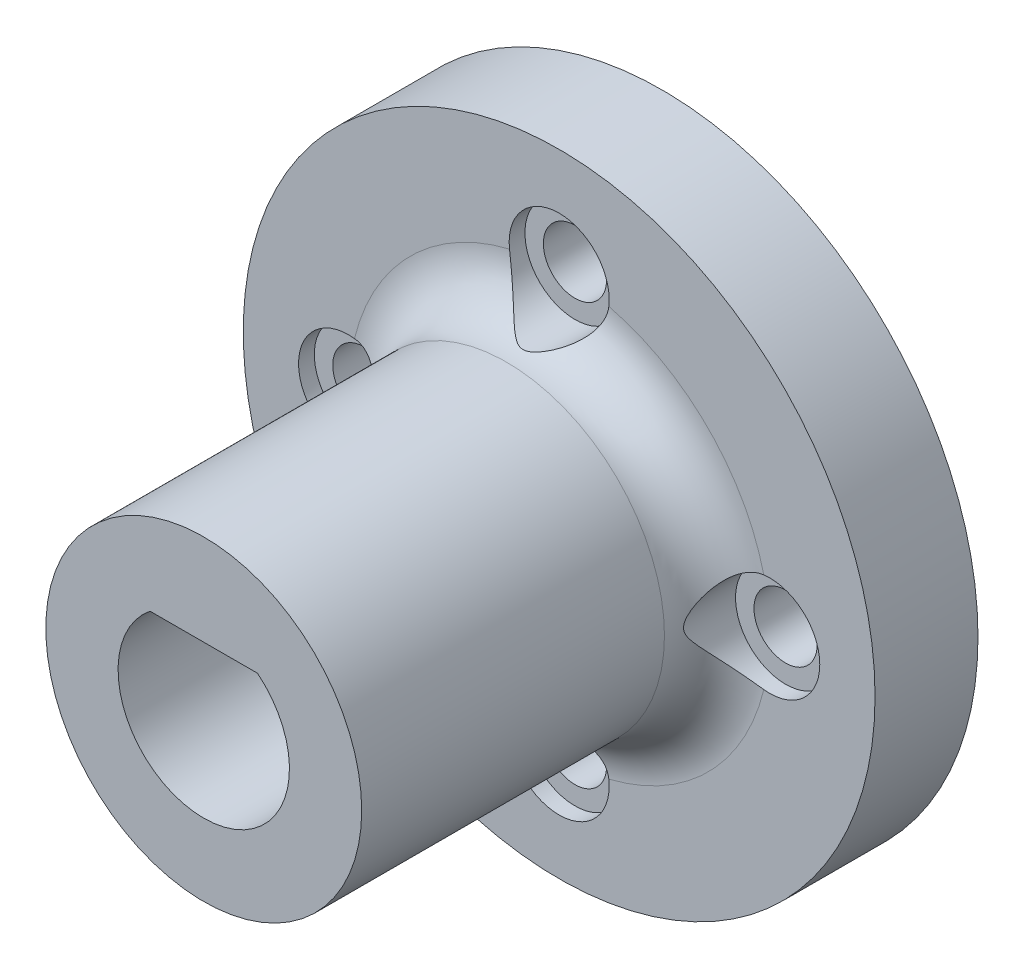
ISO-10303-21;
HEADER;
FILE_DESCRIPTION(('STEP AP214'),'2;1');
FILE_NAME('part.step','',(''),(''),'','','');
FILE_SCHEMA(('AUTOMOTIVE_DESIGN { 1 0 10303 214 1 1 1 1 }'));
ENDSEC;
DATA;
#1=APPLICATION_CONTEXT('core data for automotive mechanical design processes');
#2=APPLICATION_PROTOCOL_DEFINITION('international standard','automotive_design',2000,#1);
#3=PRODUCT_CONTEXT('',#1,'mechanical');
#4=PRODUCT('Part','Part','',(#3));
#5=PRODUCT_RELATED_PRODUCT_CATEGORY('part','',(#4));
#6=PRODUCT_DEFINITION_FORMATION('','',#4);
#7=PRODUCT_DEFINITION_CONTEXT('part definition',#1,'design');
#8=PRODUCT_DEFINITION('design','',#6,#7);
#9=PRODUCT_DEFINITION_SHAPE('','',#8);
#10=(LENGTH_UNIT() NAMED_UNIT(*) SI_UNIT(.MILLI.,.METRE.));
#11=(NAMED_UNIT(*) PLANE_ANGLE_UNIT() SI_UNIT($,.RADIAN.));
#12=(NAMED_UNIT(*) SI_UNIT($,.STERADIAN.) SOLID_ANGLE_UNIT());
#13=UNCERTAINTY_MEASURE_WITH_UNIT(LENGTH_MEASURE(1.E-05),#10,'distance_accuracy_value','');
#14=(GEOMETRIC_REPRESENTATION_CONTEXT(3) GLOBAL_UNCERTAINTY_ASSIGNED_CONTEXT((#13)) GLOBAL_UNIT_ASSIGNED_CONTEXT((#10,
#11,#12)) REPRESENTATION_CONTEXT('',''));
#15=CARTESIAN_POINT('',(0.,0.,0.));
#16=DIRECTION('',(0.,0.,1.));
#17=DIRECTION('',(1.,0.,0.));
#18=AXIS2_PLACEMENT_3D('',#15,#16,#17);
#19=CARTESIAN_POINT('',(0.,0.,3.91));
#20=DIRECTION('',(0.,0.,-1.));
#21=DIRECTION('',(-1.,0.,0.));
#22=AXIS2_PLACEMENT_3D('',#19,#20,#21);
#23=CYLINDRICAL_SURFACE('',#22,12.);
#24=CARTESIAN_POINT('',(0.,0.,3.91));
#25=DIRECTION('',(0.,0.,1.));
#26=DIRECTION('',(1.,0.,0.));
#27=AXIS2_PLACEMENT_3D('',#24,#25,#26);
#28=CIRCLE('',#27,12.);
#29=CARTESIAN_POINT('',(12.,0.,3.91));
#30=VERTEX_POINT('',#29);
#31=EDGE_CURVE('E133',#30,#30,#28,.T.);
#32=ORIENTED_EDGE('',*,*,#31,.F.);
#33=EDGE_LOOP('',(#32));
#34=FACE_BOUND('',#33,.T.);
#35=CARTESIAN_POINT('',(0.,0.,0.));
#36=DIRECTION('',(0.,0.,1.));
#37=DIRECTION('',(1.,0.,0.));
#38=AXIS2_PLACEMENT_3D('',#35,#36,#37);
#39=CIRCLE('',#38,12.);
#40=CARTESIAN_POINT('',(12.,0.,0.));
#41=VERTEX_POINT('',#40);
#42=EDGE_CURVE('E130',#41,#41,#39,.T.);
#43=ORIENTED_EDGE('',*,*,#42,.T.);
#44=EDGE_LOOP('',(#43));
#45=FACE_BOUND('',#44,.T.);
#46=ADVANCED_FACE('F37',(#34,#45),#23,.T.);
#47=CARTESIAN_POINT('',(0.,0.,3.91));
#48=DIRECTION('',(0.,0.,1.));
#49=DIRECTION('',(1.,0.,0.));
#50=AXIS2_PLACEMENT_3D('',#47,#48,#49);
#51=PLANE('',#50);
#52=CARTESIAN_POINT('',(0.,-8.,3.91));
#53=DIRECTION('',(0.,0.,1.));
#54=DIRECTION('',(1.,0.,0.));
#55=AXIS2_PLACEMENT_3D('',#52,#53,#54);
#56=CIRCLE('',#55,1.9);
#57=CARTESIAN_POINT('',(-1.8865559518273,-7.774375,3.91));
#58=VERTEX_POINT('',#57);
#59=CARTESIAN_POINT('',(1.8865559518273,-7.774375,3.91));
#60=VERTEX_POINT('',#59);
#61=EDGE_CURVE('E406',#58,#60,#56,.T.);
#62=ORIENTED_EDGE('',*,*,#61,.F.);
#63=CARTESIAN_POINT('',(0.,0.,3.91));
#64=DIRECTION('',(0.,0.,1.));
#65=DIRECTION('',(1.,0.,0.));
#66=AXIS2_PLACEMENT_3D('',#63,#64,#65);
#67=CIRCLE('',#66,8.);
#68=CARTESIAN_POINT('',(-7.77437499999999,-1.88655595182732,3.91));
#69=VERTEX_POINT('',#68);
#70=EDGE_CURVE('E146',#58,#69,#67,.F.);
#71=ORIENTED_EDGE('',*,*,#70,.T.);
#72=CARTESIAN_POINT('',(-8.,0.,3.91));
#73=DIRECTION('',(0.,0.,1.));
#74=DIRECTION('',(1.,0.,0.));
#75=AXIS2_PLACEMENT_3D('',#72,#73,#74);
#76=CIRCLE('',#75,1.9);
#77=CARTESIAN_POINT('',(-7.77437500000001,1.88655595182727,3.91));
#78=VERTEX_POINT('',#77);
#79=EDGE_CURVE('E404',#78,#69,#76,.T.);
#80=ORIENTED_EDGE('',*,*,#79,.F.);
#81=CARTESIAN_POINT('',(0.,0.,3.91));
#82=DIRECTION('',(0.,0.,1.));
#83=DIRECTION('',(1.,0.,0.));
#84=AXIS2_PLACEMENT_3D('',#81,#82,#83);
#85=CIRCLE('',#84,8.);
#86=CARTESIAN_POINT('',(-1.8865559518273,7.774375,3.91));
#87=VERTEX_POINT('',#86);
#88=EDGE_CURVE('E64',#78,#87,#85,.F.);
#89=ORIENTED_EDGE('',*,*,#88,.T.);
#90=CARTESIAN_POINT('',(0.,8.,3.91));
#91=DIRECTION('',(0.,0.,1.));
#92=DIRECTION('',(1.,0.,0.));
#93=AXIS2_PLACEMENT_3D('',#90,#91,#92);
#94=CIRCLE('',#93,1.9);
#95=CARTESIAN_POINT('',(1.8865559518273,7.774375,3.91));
#96=VERTEX_POINT('',#95);
#97=EDGE_CURVE('E423',#96,#87,#94,.T.);
#98=ORIENTED_EDGE('',*,*,#97,.F.);
#99=CARTESIAN_POINT('',(0.,0.,3.91));
#100=DIRECTION('',(0.,0.,1.));
#101=DIRECTION('',(1.,0.,0.));
#102=AXIS2_PLACEMENT_3D('',#99,#100,#101);
#103=CIRCLE('',#102,8.);
#104=CARTESIAN_POINT('',(7.77437499999998,1.88655595182738,3.91));
#105=VERTEX_POINT('',#104);
#106=EDGE_CURVE('E143',#96,#105,#103,.F.);
#107=ORIENTED_EDGE('',*,*,#106,.T.);
#108=CARTESIAN_POINT('',(8.,0.,3.91));
#109=DIRECTION('',(0.,0.,1.));
#110=DIRECTION('',(1.,0.,0.));
#111=AXIS2_PLACEMENT_3D('',#108,#109,#110);
#112=CIRCLE('',#111,1.9);
#113=CARTESIAN_POINT('',(7.77437500000002,-1.88655595182722,3.91));
#114=VERTEX_POINT('',#113);
#115=EDGE_CURVE('E449',#114,#105,#112,.T.);
#116=ORIENTED_EDGE('',*,*,#115,.F.);
#117=CARTESIAN_POINT('',(0.,0.,3.91));
#118=DIRECTION('',(0.,0.,1.));
#119=DIRECTION('',(1.,0.,0.));
#120=AXIS2_PLACEMENT_3D('',#117,#118,#119);
#121=CIRCLE('',#120,8.);
#122=EDGE_CURVE('E141',#114,#60,#121,.F.);
#123=ORIENTED_EDGE('',*,*,#122,.T.);
#124=EDGE_LOOP('',(#62,#71,#80,#89,#98,#107,#116,#123));
#125=FACE_BOUND('',#124,.T.);
#126=ORIENTED_EDGE('',*,*,#31,.T.);
#127=EDGE_LOOP('',(#126));
#128=FACE_BOUND('',#127,.T.);
#129=ADVANCED_FACE('F209',(#125,#128),#51,.T.);
#130=CARTESIAN_POINT('',(0.,0.,0.));
#131=DIRECTION('',(0.,0.,1.));
#132=DIRECTION('',(1.,0.,0.));
#133=AXIS2_PLACEMENT_3D('',#130,#131,#132);
#134=PLANE('',#133);
#135=CARTESIAN_POINT('',(8.,0.,0.));
#136=DIRECTION('',(0.,0.,1.));
#137=DIRECTION('',(1.,0.,0.));
#138=AXIS2_PLACEMENT_3D('',#135,#136,#137);
#139=CIRCLE('',#138,1.20000000000001);
#140=CARTESIAN_POINT('',(9.20000000000001,0.,0.));
#141=VERTEX_POINT('',#140);
#142=EDGE_CURVE('E455',#141,#141,#139,.T.);
#143=ORIENTED_EDGE('',*,*,#142,.T.);
#144=EDGE_LOOP('',(#143));
#145=FACE_BOUND('',#144,.T.);
#146=CARTESIAN_POINT('',(0.,-8.,0.));
#147=DIRECTION('',(0.,0.,1.));
#148=DIRECTION('',(1.,0.,0.));
#149=AXIS2_PLACEMENT_3D('',#146,#147,#148);
#150=CIRCLE('',#149,1.20000000000001);
#151=CARTESIAN_POINT('',(1.20000000000001,-8.,0.));
#152=VERTEX_POINT('',#151);
#153=EDGE_CURVE('E408',#152,#152,#150,.T.);
#154=ORIENTED_EDGE('',*,*,#153,.T.);
#155=EDGE_LOOP('',(#154));
#156=FACE_BOUND('',#155,.T.);
#157=CARTESIAN_POINT('',(-8.,0.,0.));
#158=DIRECTION('',(0.,0.,1.));
#159=DIRECTION('',(1.,0.,0.));
#160=AXIS2_PLACEMENT_3D('',#157,#158,#159);
#161=CIRCLE('',#160,1.20000000000001);
#162=CARTESIAN_POINT('',(-6.79999999999999,0.,0.));
#163=VERTEX_POINT('',#162);
#164=EDGE_CURVE('E420',#163,#163,#161,.T.);
#165=ORIENTED_EDGE('',*,*,#164,.T.);
#166=EDGE_LOOP('',(#165));
#167=FACE_BOUND('',#166,.T.);
#168=CARTESIAN_POINT('',(0.,8.,0.));
#169=DIRECTION('',(0.,0.,1.));
#170=DIRECTION('',(1.,0.,0.));
#171=AXIS2_PLACEMENT_3D('',#168,#169,#170);
#172=CIRCLE('',#171,1.20000000000001);
#173=CARTESIAN_POINT('',(1.20000000000001,8.,0.));
#174=VERTEX_POINT('',#173);
#175=EDGE_CURVE('E124',#174,#174,#172,.T.);
#176=ORIENTED_EDGE('',*,*,#175,.T.);
#177=EDGE_LOOP('',(#176));
#178=FACE_BOUND('',#177,.T.);
#179=CARTESIAN_POINT('',(0.,0.,0.));
#180=DIRECTION('',(0.,0.,-1.));
#181=DIRECTION('',(-1.,0.,0.));
#182=AXIS2_PLACEMENT_3D('',#179,#180,#181);
#183=CIRCLE('',#182,4.15);
#184=CARTESIAN_POINT('',(-4.15,0.,0.));
#185=VERTEX_POINT('',#184);
#186=EDGE_CURVE('E107',#185,#185,#183,.T.);
#187=ORIENTED_EDGE('',*,*,#186,.F.);
#188=EDGE_LOOP('',(#187));
#189=FACE_BOUND('',#188,.T.);
#190=ORIENTED_EDGE('',*,*,#42,.F.);
#191=EDGE_LOOP('',(#190));
#192=FACE_BOUND('',#191,.T.);
#193=ADVANCED_FACE('F207',(#145,#156,#167,#178,#189,#192),#134,.F.);
#194=CARTESIAN_POINT('',(0.,0.,2.5));
#195=DIRECTION('',(0.,0.,-1.));
#196=DIRECTION('',(-1.,0.,0.));
#197=AXIS2_PLACEMENT_3D('',#194,#195,#196);
#198=CYLINDRICAL_SURFACE('',#197,4.15);
#199=CARTESIAN_POINT('',(0.,0.,2.5));
#200=DIRECTION('',(0.,0.,-1.));
#201=DIRECTION('',(-1.,0.,0.));
#202=AXIS2_PLACEMENT_3D('',#199,#200,#201);
#203=CIRCLE('',#202,4.15);
#204=CARTESIAN_POINT('',(-4.15,0.,2.5));
#205=VERTEX_POINT('',#204);
#206=EDGE_CURVE('E127',#205,#205,#203,.T.);
#207=ORIENTED_EDGE('',*,*,#206,.F.);
#208=EDGE_LOOP('',(#207));
#209=FACE_BOUND('',#208,.T.);
#210=ORIENTED_EDGE('',*,*,#186,.T.);
#211=EDGE_LOOP('',(#210));
#212=FACE_BOUND('',#211,.T.);
#213=ADVANCED_FACE('F203',(#209,#212),#198,.F.);
#214=CARTESIAN_POINT('',(0.,0.,2.5));
#215=DIRECTION('',(0.,0.,-1.));
#216=DIRECTION('',(-1.,0.,0.));
#217=AXIS2_PLACEMENT_3D('',#214,#215,#216);
#218=PLANE('',#217);
#219=ORIENTED_EDGE('',*,*,#206,.T.);
#220=EDGE_LOOP('',(#219));
#221=FACE_BOUND('',#220,.T.);
#222=ADVANCED_FACE('F200',(#221),#218,.T.);
#223=CARTESIAN_POINT('',(0.,2.535,17.41));
#224=DIRECTION('',(0.,-1.,0.));
#225=DIRECTION('',(0.,0.,-1.));
#226=AXIS2_PLACEMENT_3D('',#223,#224,#225);
#227=PLANE('',#226);
#228=DIRECTION('',(-1.,0.,0.));
#229=VECTOR('',#228,1.);
#230=CARTESIAN_POINT('',(0.,2.535,3.91));
#231=LINE('',#230,#229);
#232=CARTESIAN_POINT('',(2.04176394326083,2.535,3.91));
#233=VERTEX_POINT('',#232);
#234=CARTESIAN_POINT('',(-2.04176394326083,2.535,3.91));
#235=VERTEX_POINT('',#234);
#236=EDGE_CURVE('E103',#233,#235,#231,.T.);
#237=ORIENTED_EDGE('',*,*,#236,.F.);
#238=DIRECTION('',(0.,0.,-1.));
#239=VECTOR('',#238,1.);
#240=CARTESIAN_POINT('',(2.04176394326083,2.535,17.41));
#241=LINE('',#240,#239);
#242=CARTESIAN_POINT('',(2.04176394326083,2.535,17.41));
#243=VERTEX_POINT('',#242);
#244=EDGE_CURVE('E97',#243,#233,#241,.T.);
#245=ORIENTED_EDGE('',*,*,#244,.F.);
#246=DIRECTION('',(-1.,0.,0.));
#247=VECTOR('',#246,1.);
#248=CARTESIAN_POINT('',(0.,2.535,17.41));
#249=LINE('',#248,#247);
#250=CARTESIAN_POINT('',(-2.04176394326083,2.535,17.41));
#251=VERTEX_POINT('',#250);
#252=EDGE_CURVE('E101',#243,#251,#249,.T.);
#253=ORIENTED_EDGE('',*,*,#252,.T.);
#254=DIRECTION('',(0.,0.,-1.));
#255=VECTOR('',#254,1.);
#256=CARTESIAN_POINT('',(-2.04176394326083,2.535,17.41));
#257=LINE('',#256,#255);
#258=EDGE_CURVE('E108',#251,#235,#257,.T.);
#259=ORIENTED_EDGE('',*,*,#258,.T.);
#260=EDGE_LOOP('',(#237,#245,#253,#259));
#261=FACE_BOUND('',#260,.T.);
#262=ADVANCED_FACE('F99',(#261),#227,.T.);
#263=CARTESIAN_POINT('',(0.,0.,17.41));
#264=DIRECTION('',(0.,0.,-1.));
#265=DIRECTION('',(-1.,0.,0.));
#266=AXIS2_PLACEMENT_3D('',#263,#264,#265);
#267=CYLINDRICAL_SURFACE('',#266,3.255);
#268=CARTESIAN_POINT('',(0.,0.,3.91));
#269=DIRECTION('',(0.,0.,1.));
#270=DIRECTION('',(1.,0.,0.));
#271=AXIS2_PLACEMENT_3D('',#268,#269,#270);
#272=CIRCLE('',#271,3.255);
#273=EDGE_CURVE('E114',#235,#233,#272,.T.);
#274=ORIENTED_EDGE('',*,*,#273,.F.);
#275=ORIENTED_EDGE('',*,*,#258,.F.);
#276=CARTESIAN_POINT('',(0.,0.,17.41));
#277=DIRECTION('',(0.,0.,1.));
#278=DIRECTION('',(1.,0.,0.));
#279=AXIS2_PLACEMENT_3D('',#276,#277,#278);
#280=CIRCLE('',#279,3.255);
#281=EDGE_CURVE('E113',#251,#243,#280,.T.);
#282=ORIENTED_EDGE('',*,*,#281,.T.);
#283=ORIENTED_EDGE('',*,*,#244,.T.);
#284=EDGE_LOOP('',(#274,#275,#282,#283));
#285=FACE_BOUND('',#284,.T.);
#286=ADVANCED_FACE('F116',(#285),#267,.F.);
#287=CARTESIAN_POINT('',(0.,0.,17.41));
#288=DIRECTION('',(0.,0.,-1.));
#289=DIRECTION('',(-1.,0.,0.));
#290=AXIS2_PLACEMENT_3D('',#287,#288,#289);
#291=CYLINDRICAL_SURFACE('',#290,6.);
#292=CARTESIAN_POINT('',(0.,0.,5.91));
#293=DIRECTION('',(0.,0.,1.));
#294=DIRECTION('',(1.,0.,0.));
#295=AXIS2_PLACEMENT_3D('',#292,#293,#294);
#296=CIRCLE('',#295,6.);
#297=CARTESIAN_POINT('',(6.,0.,5.91));
#298=VERTEX_POINT('',#297);
#299=EDGE_CURVE('E136',#298,#298,#296,.T.);
#300=ORIENTED_EDGE('',*,*,#299,.T.);
#301=EDGE_LOOP('',(#300));
#302=FACE_BOUND('',#301,.T.);
#303=CARTESIAN_POINT('',(0.,0.,17.41));
#304=DIRECTION('',(0.,0.,1.));
#305=DIRECTION('',(1.,0.,0.));
#306=AXIS2_PLACEMENT_3D('',#303,#304,#305);
#307=CIRCLE('',#306,6.);
#308=CARTESIAN_POINT('',(6.,0.,17.41));
#309=VERTEX_POINT('',#308);
#310=EDGE_CURVE('E117',#309,#309,#307,.T.);
#311=ORIENTED_EDGE('',*,*,#310,.F.);
#312=EDGE_LOOP('',(#311));
#313=FACE_BOUND('',#312,.T.);
#314=ADVANCED_FACE('F192',(#302,#313),#291,.T.);
#315=CARTESIAN_POINT('',(0.,0.,17.41));
#316=DIRECTION('',(0.,0.,1.));
#317=DIRECTION('',(1.,0.,0.));
#318=AXIS2_PLACEMENT_3D('',#315,#316,#317);
#319=PLANE('',#318);
#320=ORIENTED_EDGE('',*,*,#252,.F.);
#321=ORIENTED_EDGE('',*,*,#281,.F.);
#322=EDGE_LOOP('',(#320,#321));
#323=FACE_BOUND('',#322,.T.);
#324=ORIENTED_EDGE('',*,*,#310,.T.);
#325=EDGE_LOOP('',(#324));
#326=FACE_BOUND('',#325,.T.);
#327=ADVANCED_FACE('F111',(#323,#326),#319,.T.);
#328=ORIENTED_EDGE('',*,*,#236,.T.);
#329=ORIENTED_EDGE('',*,*,#273,.T.);
#330=EDGE_LOOP('',(#328,#329));
#331=FACE_BOUND('',#330,.T.);
#332=ADVANCED_FACE('F188',(#331),#51,.T.);
#333=CARTESIAN_POINT('',(0.,8.,3.91));
#334=DIRECTION('',(0.,0.,1.));
#335=DIRECTION('',(1.,0.,0.));
#336=AXIS2_PLACEMENT_3D('',#333,#334,#335);
#337=CYLINDRICAL_SURFACE('',#336,1.20000000000001);
#338=ORIENTED_EDGE('',*,*,#175,.F.);
#339=EDGE_LOOP('',(#338));
#340=FACE_BOUND('',#339,.T.);
#341=CARTESIAN_POINT('',(0.,8.,3.31));
#342=DIRECTION('',(0.,0.,1.));
#343=DIRECTION('',(1.,0.,0.));
#344=AXIS2_PLACEMENT_3D('',#341,#342,#343);
#345=CIRCLE('',#344,1.2);
#346=CARTESIAN_POINT('',(1.2,8.,3.31));
#347=VERTEX_POINT('',#346);
#348=EDGE_CURVE('E428',#347,#347,#345,.T.);
#349=ORIENTED_EDGE('',*,*,#348,.T.);
#350=EDGE_LOOP('',(#349));
#351=FACE_BOUND('',#350,.T.);
#352=ADVANCED_FACE('F184',(#340,#351),#337,.F.);
#353=CARTESIAN_POINT('',(1.2,8.,3.31));
#354=DIRECTION('',(0.,0.,-1.));
#355=DIRECTION('',(-1.,0.,0.));
#356=AXIS2_PLACEMENT_3D('',#353,#354,#355);
#357=PLANE('',#356);
#358=ORIENTED_EDGE('',*,*,#348,.F.);
#359=EDGE_LOOP('',(#358));
#360=FACE_BOUND('',#359,.T.);
#361=CARTESIAN_POINT('',(0.,8.,3.31));
#362=DIRECTION('',(0.,0.,1.));
#363=DIRECTION('',(1.,0.,0.));
#364=AXIS2_PLACEMENT_3D('',#361,#362,#363);
#365=CIRCLE('',#364,1.9);
#366=CARTESIAN_POINT('',(1.9,8.,3.31));
#367=VERTEX_POINT('',#366);
#368=EDGE_CURVE('E425',#367,#367,#365,.T.);
#369=ORIENTED_EDGE('',*,*,#368,.T.);
#370=EDGE_LOOP('',(#369));
#371=FACE_BOUND('',#370,.T.);
#372=ADVANCED_FACE('F180',(#360,#371),#357,.F.);
#373=CARTESIAN_POINT('',(0.,8.,3.91));
#374=DIRECTION('',(0.,0.,1.));
#375=DIRECTION('',(1.,0.,0.));
#376=AXIS2_PLACEMENT_3D('',#373,#374,#375);
#377=CYLINDRICAL_SURFACE('',#376,1.9);
#378=ORIENTED_EDGE('',*,*,#368,.F.);
#379=EDGE_LOOP('',(#378));
#380=FACE_BOUND('',#379,.T.);
#381=ORIENTED_EDGE('',*,*,#97,.T.);
#382=CARTESIAN_POINT('',(-1.8865559518273,7.774375,3.91));
#383=CARTESIAN_POINT('',(-1.88153527147394,7.73231030689947,3.90999007388745));
#384=CARTESIAN_POINT('',(-1.87508853380747,7.69041914331872,3.91132660636537));
#385=CARTESIAN_POINT('',(-1.85946159721021,7.60734490672894,3.91668164896566));
#386=CARTESIAN_POINT('',(-1.85028275625928,7.56616149266765,3.92069882791359));
#387=CARTESIAN_POINT('',(-1.82938346606968,7.48512539905984,3.93136421899163));
#388=CARTESIAN_POINT('',(-1.81768252990285,7.44526507297438,3.93799253800226));
#389=CARTESIAN_POINT('',(-1.79188086064241,7.36685777426196,3.95379394585881));
#390=CARTESIAN_POINT('',(-1.77777998946746,7.32831087735698,3.96296718114678));
#391=CARTESIAN_POINT('',(-1.73222142775039,7.21514706277265,3.99410379227338));
#392=CARTESIAN_POINT('',(-1.69745561543648,7.14280931420238,4.01971075851351));
#393=CARTESIAN_POINT('',(-1.62095480109144,7.00566364361453,4.07924109513203));
#394=CARTESIAN_POINT('',(-1.57921042924436,6.94086604653207,4.11317567570091));
#395=CARTESIAN_POINT('',(-1.47275804519548,6.79498114373688,4.20265272873021));
#396=CARTESIAN_POINT('',(-1.40553350045342,6.71771081969501,4.2614142176167));
#397=CARTESIAN_POINT('',(-1.26414261535923,6.578064711889,4.38809429924861));
#398=CARTESIAN_POINT('',(-1.18994719169804,6.51575556993964,4.45605182914705));
#399=CARTESIAN_POINT('',(-1.05802312369229,6.42036937437304,4.57760154914951));
#400=CARTESIAN_POINT('',(-1.00145906027485,6.38398310117468,4.62992750140869));
#401=CARTESIAN_POINT('',(-0.885769262617152,6.317779599654,4.73610023464723));
#402=CARTESIAN_POINT('',(-0.826639277612613,6.28797381175919,4.78994948346447));
#403=CARTESIAN_POINT('',(-0.705742096798071,6.23469858777346,4.89718926534853));
#404=CARTESIAN_POINT('',(-0.64398945845158,6.21119841504561,4.95058074834547));
#405=CARTESIAN_POINT('',(-0.548080888292291,6.18046113590552,5.02822386982199));
#406=CARTESIAN_POINT('',(-0.51560638890887,6.17097637483959,5.05366799002837));
#407=CARTESIAN_POINT('',(-0.449153041524249,6.15353192519293,5.10305433952623));
#408=CARTESIAN_POINT('',(-0.415175365290372,6.14557107360093,5.12699770469595));
#409=CARTESIAN_POINT('',(-0.349927082316774,6.1322464919056,5.16916201411102));
#410=CARTESIAN_POINT('',(-0.318918896151809,6.12667665747826,5.18771809135307));
#411=CARTESIAN_POINT('',(-0.254954959448013,6.1169063256226,5.22156003546182));
#412=CARTESIAN_POINT('',(-0.22200277095412,6.11270341030133,5.23685166004754));
#413=CARTESIAN_POINT('',(-0.160909421552778,6.1066314392514,5.25956241324692));
#414=CARTESIAN_POINT('',(-0.133172903497332,6.10446014565627,5.26795388432903));
#415=CARTESIAN_POINT('',(-0.076653863038014,6.10133733614165,5.28015422915125));
#416=CARTESIAN_POINT('',(-0.0478739291233625,6.10038298918652,5.28397373757134));
#417=CARTESIAN_POINT('',(0.0100951777491299,6.09980480780253,5.28627758996955));
#418=CARTESIAN_POINT('',(0.0392857578009839,6.10018875232513,5.28473074171475));
#419=CARTESIAN_POINT('',(0.0969059739876085,6.10225258098281,5.27657158148795));
#420=CARTESIAN_POINT('',(0.125334185378853,6.10393473737854,5.26995038802959));
#421=CARTESIAN_POINT('',(0.194470922919001,6.10952135495081,5.24861662160283));
#422=CARTESIAN_POINT('',(0.234360448440443,6.1141112540307,5.23152792081691));
#423=CARTESIAN_POINT('',(0.311369717248827,6.12527992858931,5.1923578215658));
#424=CARTESIAN_POINT('',(0.348473713147605,6.1318690839931,5.17025052165298));
#425=CARTESIAN_POINT('',(0.443161535701245,6.15143134638862,5.10864217513066));
#426=CARTESIAN_POINT('',(0.49898436105154,6.16581570538219,5.06693229904083));
#427=CARTESIAN_POINT('',(0.607325764516102,6.19879190319363,4.98088885418736));
#428=CARTESIAN_POINT('',(0.659836597120976,6.21739316904824,4.93654957385263));
#429=CARTESIAN_POINT('',(0.76268878159599,6.25891252670268,4.8471008071775));
#430=CARTESIAN_POINT('',(0.813024871318574,6.28184043925317,4.80198978519609));
#431=CARTESIAN_POINT('',(0.911804474042831,6.33216432200733,4.71233179201921));
#432=CARTESIAN_POINT('',(0.960249918501561,6.35955557611178,4.66778427837175));
#433=CARTESIAN_POINT('',(1.09220035950755,6.44210892474117,4.54618425148844));
#434=CARTESIAN_POINT('',(1.17392747315365,6.50239589666081,4.47056114632566));
#435=CARTESIAN_POINT('',(1.33051715284509,6.63967521160762,4.32815889859188));
#436=CARTESIAN_POINT('',(1.40540217896432,6.71660988206097,4.26135047442761));
#437=CARTESIAN_POINT('',(1.52504327546429,6.86399331412822,4.15830713429829));
#438=CARTESIAN_POINT('',(1.57231471772772,6.9300748585658,4.11877862999548));
#439=CARTESIAN_POINT('',(1.65960559326496,7.07125279933405,4.04862439565742));
#440=CARTESIAN_POINT('',(1.69962925729245,7.14634389366891,4.01799346548172));
#441=CARTESIAN_POINT('',(1.76596914335011,7.29489676909623,3.97049323878174));
#442=CARTESIAN_POINT('',(1.79334707170157,7.36749948138595,3.95242424430524));
#443=CARTESIAN_POINT('',(1.83924522716515,7.51703052470821,3.92556013086808));
#444=CARTESIAN_POINT('',(1.85778344124416,7.59394971285032,3.91674613558508));
#445=CARTESIAN_POINT('',(1.87443100769344,7.68885589868873,3.91177266610838));
#446=CARTESIAN_POINT('',(1.8771828401304,7.70591626811937,3.91110684240652));
#447=CARTESIAN_POINT('',(1.88221872510259,7.74009828456671,3.91022123891659));
#448=CARTESIAN_POINT('',(1.88450328892569,7.75721984352226,3.91000096922839));
#449=CARTESIAN_POINT('',(1.8865559518273,7.774375,3.91));
#450=B_SPLINE_CURVE_WITH_KNOTS('',3,(#382,#383,#384,#385,#386,#387,#388,#389,#390,#391,#392,
#393,#394,#395,#396,#397,#398,#399,#400,#401,#402,#403,#404,#405,#406,#407,#408,#409,#410,#411,
#412,#413,#414,#415,#416,#417,#418,#419,#420,#421,#422,#423,#424,#425,#426,#427,#428,#429,#430,
#431,#432,#433,#434,#435,#436,#437,#438,#439,#440,#441,#442,#443,#444,#445,#446,#447,#448,#449),
.UNSPECIFIED.,.F.,.F.,(4,2,2,2,2,2,2,2,2,2,2,2,2,2,2,2,2,2,2,2,2,2,2,2,2,2,2,2,2,2,2,2,2,4),(0.,
0.127039127143782,0.254015215197065,0.380042077531519,0.506076193330885,0.757534249458638,
1.00933267993642,1.36160389615219,1.71541628081162,1.97075150832247,2.22652721020029,
2.48103250301404,2.60797566218926,2.73482155172849,2.84437510750446,2.95373381052281,
3.0405976524087,3.12725904830555,3.2144250100578,3.30174388540128,3.43190913685683,
3.56276210470317,3.77573616791863,3.98919112075313,4.20313653829901,4.41685734344375,
4.79541530449396,5.17268224499223,5.44276510981855,5.71268980706745,5.95066694521522,
6.18815776125346,6.2400327011701,6.29185057194703),.UNSPECIFIED.);
#451=EDGE_CURVE('E57',#87,#96,#450,.T.);
#452=ORIENTED_EDGE('',*,*,#451,.T.);
#453=EDGE_LOOP('',(#381,#452));
#454=FACE_BOUND('',#453,.T.);
#455=ADVANCED_FACE('F175',(#380,#454),#377,.F.);
#456=CARTESIAN_POINT('',(-8.,0.,3.91));
#457=DIRECTION('',(0.,0.,1.));
#458=DIRECTION('',(1.,0.,0.));
#459=AXIS2_PLACEMENT_3D('',#456,#457,#458);
#460=CYLINDRICAL_SURFACE('',#459,1.20000000000001);
#461=ORIENTED_EDGE('',*,*,#164,.F.);
#462=EDGE_LOOP('',(#461));
#463=FACE_BOUND('',#462,.T.);
#464=CARTESIAN_POINT('',(-8.,0.,3.31));
#465=DIRECTION('',(0.,0.,1.));
#466=DIRECTION('',(1.,0.,0.));
#467=AXIS2_PLACEMENT_3D('',#464,#465,#466);
#468=CIRCLE('',#467,1.2);
#469=CARTESIAN_POINT('',(-6.8,0.,3.31));
#470=VERTEX_POINT('',#469);
#471=EDGE_CURVE('E411',#470,#470,#468,.T.);
#472=ORIENTED_EDGE('',*,*,#471,.T.);
#473=EDGE_LOOP('',(#472));
#474=FACE_BOUND('',#473,.T.);
#475=ADVANCED_FACE('F172',(#463,#474),#460,.F.);
#476=CARTESIAN_POINT('',(-6.8,0.,3.31));
#477=DIRECTION('',(0.,0.,-1.));
#478=DIRECTION('',(-1.,0.,0.));
#479=AXIS2_PLACEMENT_3D('',#476,#477,#478);
#480=PLANE('',#479);
#481=ORIENTED_EDGE('',*,*,#471,.F.);
#482=EDGE_LOOP('',(#481));
#483=FACE_BOUND('',#482,.T.);
#484=CARTESIAN_POINT('',(-8.,0.,3.31));
#485=DIRECTION('',(0.,0.,1.));
#486=DIRECTION('',(1.,0.,0.));
#487=AXIS2_PLACEMENT_3D('',#484,#485,#486);
#488=CIRCLE('',#487,1.9);
#489=CARTESIAN_POINT('',(-6.1,0.,3.31));
#490=VERTEX_POINT('',#489);
#491=EDGE_CURVE('E407',#490,#490,#488,.T.);
#492=ORIENTED_EDGE('',*,*,#491,.T.);
#493=EDGE_LOOP('',(#492));
#494=FACE_BOUND('',#493,.T.);
#495=ADVANCED_FACE('F167',(#483,#494),#480,.F.);
#496=CARTESIAN_POINT('',(-8.,0.,3.91));
#497=DIRECTION('',(0.,0.,1.));
#498=DIRECTION('',(1.,0.,0.));
#499=AXIS2_PLACEMENT_3D('',#496,#497,#498);
#500=CYLINDRICAL_SURFACE('',#499,1.9);
#501=ORIENTED_EDGE('',*,*,#491,.F.);
#502=EDGE_LOOP('',(#501));
#503=FACE_BOUND('',#502,.T.);
#504=ORIENTED_EDGE('',*,*,#79,.T.);
#505=CARTESIAN_POINT('',(-7.77437499999999,-1.88655595182732,3.91));
#506=CARTESIAN_POINT('',(-7.73231030689946,-1.88153527147397,3.90999007388745));
#507=CARTESIAN_POINT('',(-7.69041914331871,-1.87508853380749,3.91132660636537));
#508=CARTESIAN_POINT('',(-7.60734490672893,-1.85946159721024,3.91668164896566));
#509=CARTESIAN_POINT('',(-7.56616149266764,-1.8502827562593,3.92069882791359));
#510=CARTESIAN_POINT('',(-7.48512539905983,-1.82938346606971,3.93136421899163));
#511=CARTESIAN_POINT('',(-7.44526507297438,-1.81768252990288,3.93799253800226));
#512=CARTESIAN_POINT('',(-7.36685777426196,-1.79188086064243,3.95379394585881));
#513=CARTESIAN_POINT('',(-7.32831087735697,-1.77777998946748,3.96296718114678));
#514=CARTESIAN_POINT('',(-7.21514706277264,-1.73222142775042,3.99410379227338));
#515=CARTESIAN_POINT('',(-7.14280931420237,-1.6974556154365,4.01971075851351));
#516=CARTESIAN_POINT('',(-7.00566364361453,-1.62095480109147,4.07924109513203));
#517=CARTESIAN_POINT('',(-6.94086604653206,-1.57921042924438,4.11317567570091));
#518=CARTESIAN_POINT('',(-6.79498114373688,-1.47275804519551,4.20265272873021));
#519=CARTESIAN_POINT('',(-6.717710819695,-1.40553350045344,4.2614142176167));
#520=CARTESIAN_POINT('',(-6.578064711889,-1.26414261535925,4.38809429924861));
#521=CARTESIAN_POINT('',(-6.51575556993964,-1.18994719169806,4.45605182914705));
#522=CARTESIAN_POINT('',(-6.42036937437304,-1.05802312369231,4.57760154914951));
#523=CARTESIAN_POINT('',(-6.38398310117468,-1.00145906027487,4.62992750140869));
#524=CARTESIAN_POINT('',(-6.31777959965399,-0.885769262617173,4.73610023464723));
#525=CARTESIAN_POINT('',(-6.28797381175919,-0.826639277612634,4.78994948346448));
#526=CARTESIAN_POINT('',(-6.23469858777346,-0.705742096798091,4.89718926534854));
#527=CARTESIAN_POINT('',(-6.21119841504561,-0.643989458451599,4.95058074834547));
#528=CARTESIAN_POINT('',(-6.18046113590552,-0.54808088829231,5.02822386982199));
#529=CARTESIAN_POINT('',(-6.17097637483959,-0.515606388908888,5.05366799002837));
#530=CARTESIAN_POINT('',(-6.15353192519293,-0.449153041524269,5.10305433952624));
#531=CARTESIAN_POINT('',(-6.14557107360093,-0.415175365290394,5.12699770469595));
#532=CARTESIAN_POINT('',(-6.1322464919056,-0.349927082316795,5.16916201411102));
#533=CARTESIAN_POINT('',(-6.12667665747826,-0.318918896151828,5.18771809135307));
#534=CARTESIAN_POINT('',(-6.1169063256226,-0.254954959448033,5.22156003546182));
#535=CARTESIAN_POINT('',(-6.11270341030133,-0.222002770954142,5.23685166004754));
#536=CARTESIAN_POINT('',(-6.1066314392514,-0.1609094215528,5.25956241324692));
#537=CARTESIAN_POINT('',(-6.10446014565627,-0.133172903497354,5.26795388432903));
#538=CARTESIAN_POINT('',(-6.10133733614165,-0.0766538630380357,5.28015422915124));
#539=CARTESIAN_POINT('',(-6.10038298918652,-0.0478739291233848,5.28397373757133));
#540=CARTESIAN_POINT('',(-6.09980480780253,0.010095177749107,5.28627758996955));
#541=CARTESIAN_POINT('',(-6.10018875232513,0.0392857578009609,5.28473074171475));
#542=CARTESIAN_POINT('',(-6.10225258098281,0.0969059739875852,5.27657158148795));
#543=CARTESIAN_POINT('',(-6.10393473737854,0.125334185378829,5.26995038802959));
#544=CARTESIAN_POINT('',(-6.10952135495081,0.194470922918976,5.24861662160283));
#545=CARTESIAN_POINT('',(-6.1141112540307,0.234360448440418,5.23152792081691));
#546=CARTESIAN_POINT('',(-6.12527992858931,0.311369717248801,5.19235782156581));
#547=CARTESIAN_POINT('',(-6.1318690839931,0.348473713147578,5.17025052165298));
#548=CARTESIAN_POINT('',(-6.15143134638862,0.443161535701217,5.10864217513066));
#549=CARTESIAN_POINT('',(-6.16581570538219,0.498984361051511,5.06693229904084));
#550=CARTESIAN_POINT('',(-6.19879190319363,0.607325764516073,4.98088885418736));
#551=CARTESIAN_POINT('',(-6.21739316904824,0.659836597120946,4.93654957385263));
#552=CARTESIAN_POINT('',(-6.25891252670268,0.76268878159596,4.84710080717751));
#553=CARTESIAN_POINT('',(-6.28184043925317,0.813024871318543,4.8019897851961));
#554=CARTESIAN_POINT('',(-6.33216432200733,0.911804474042797,4.71233179201922));
#555=CARTESIAN_POINT('',(-6.35955557611178,0.960249918501525,4.66778427837176));
#556=CARTESIAN_POINT('',(-6.44210892474116,1.09220035950752,4.54618425148845));
#557=CARTESIAN_POINT('',(-6.50239589666081,1.17392747315362,4.47056114632567));
#558=CARTESIAN_POINT('',(-6.63967521160761,1.33051715284506,4.32815889859189));
#559=CARTESIAN_POINT('',(-6.71660988206097,1.40540217896429,4.26135047442762));
#560=CARTESIAN_POINT('',(-6.86399331412822,1.52504327546426,4.1583071342983));
#561=CARTESIAN_POINT('',(-6.93007485856579,1.57231471772769,4.11877862999548));
#562=CARTESIAN_POINT('',(-7.07125279933405,1.65960559326493,4.04862439565742));
#563=CARTESIAN_POINT('',(-7.1463438936689,1.69962925729242,4.01799346548172));
#564=CARTESIAN_POINT('',(-7.29489676909623,1.76596914335009,3.97049323878174));
#565=CARTESIAN_POINT('',(-7.36749948138595,1.79334707170154,3.95242424430525));
#566=CARTESIAN_POINT('',(-7.51703052470821,1.83924522716512,3.92556013086808));
#567=CARTESIAN_POINT('',(-7.59394971285032,1.85778344124413,3.91674613558508));
#568=CARTESIAN_POINT('',(-7.68885589868873,1.87443100769341,3.91177266610838));
#569=CARTESIAN_POINT('',(-7.70591626811937,1.87718284013037,3.91110684240652));
#570=CARTESIAN_POINT('',(-7.74009828456672,1.88221872510256,3.91022123891659));
#571=CARTESIAN_POINT('',(-7.75721984352227,1.88450328892566,3.91000096922839));
#572=CARTESIAN_POINT('',(-7.77437500000001,1.88655595182727,3.91));
#573=B_SPLINE_CURVE_WITH_KNOTS('',3,(#505,#506,#507,#508,#509,#510,#511,#512,#513,#514,#515,
#516,#517,#518,#519,#520,#521,#522,#523,#524,#525,#526,#527,#528,#529,#530,#531,#532,#533,#534,
#535,#536,#537,#538,#539,#540,#541,#542,#543,#544,#545,#546,#547,#548,#549,#550,#551,#552,#553,
#554,#555,#556,#557,#558,#559,#560,#561,#562,#563,#564,#565,#566,#567,#568,#569,#570,#571,#572),
.UNSPECIFIED.,.F.,.F.,(4,2,2,2,2,2,2,2,2,2,2,2,2,2,2,2,2,2,2,2,2,2,2,2,2,2,2,2,2,2,2,2,2,4),(0.,
0.127039127143782,0.254015215197065,0.38004207753152,0.506076193330885,0.757534249458639,
1.00933267993643,1.36160389615219,1.71541628081163,1.97075150832247,2.22652721020029,
2.48103250301405,2.60797566218926,2.73482155172849,2.84437510750446,2.95373381052281,
3.0405976524087,3.12725904830555,3.2144250100578,3.30174388540128,3.43190913685683,
3.56276210470316,3.77573616791862,3.98919112075312,4.20313653829899,4.41685734344373,
4.79541530449394,5.17268224499222,5.44276510981854,5.71268980706744,5.9506669452152,
6.18815776125345,6.2400327011701,6.29185057194702),.UNSPECIFIED.);
#574=EDGE_CURVE('E149',#69,#78,#573,.T.);
#575=ORIENTED_EDGE('',*,*,#574,.T.);
#576=EDGE_LOOP('',(#504,#575));
#577=FACE_BOUND('',#576,.T.);
#578=ADVANCED_FACE('F161',(#503,#577),#500,.F.);
#579=CARTESIAN_POINT('',(0.,-8.,3.91));
#580=DIRECTION('',(0.,0.,1.));
#581=DIRECTION('',(1.,0.,0.));
#582=AXIS2_PLACEMENT_3D('',#579,#580,#581);
#583=CYLINDRICAL_SURFACE('',#582,1.20000000000001);
#584=ORIENTED_EDGE('',*,*,#153,.F.);
#585=EDGE_LOOP('',(#584));
#586=FACE_BOUND('',#585,.T.);
#587=CARTESIAN_POINT('',(0.,-8.,3.31));
#588=DIRECTION('',(0.,0.,1.));
#589=DIRECTION('',(1.,0.,0.));
#590=AXIS2_PLACEMENT_3D('',#587,#588,#589);
#591=CIRCLE('',#590,1.2);
#592=CARTESIAN_POINT('',(1.2,-8.,3.31));
#593=VERTEX_POINT('',#592);
#594=EDGE_CURVE('E414',#593,#593,#591,.T.);
#595=ORIENTED_EDGE('',*,*,#594,.T.);
#596=EDGE_LOOP('',(#595));
#597=FACE_BOUND('',#596,.T.);
#598=ADVANCED_FACE('F166',(#586,#597),#583,.F.);
#599=CARTESIAN_POINT('',(1.2,-8.,3.31));
#600=DIRECTION('',(0.,0.,-1.));
#601=DIRECTION('',(-1.,0.,0.));
#602=AXIS2_PLACEMENT_3D('',#599,#600,#601);
#603=PLANE('',#602);
#604=ORIENTED_EDGE('',*,*,#594,.F.);
#605=EDGE_LOOP('',(#604));
#606=FACE_BOUND('',#605,.T.);
#607=CARTESIAN_POINT('',(0.,-8.,3.31));
#608=DIRECTION('',(0.,0.,1.));
#609=DIRECTION('',(1.,0.,0.));
#610=AXIS2_PLACEMENT_3D('',#607,#608,#609);
#611=CIRCLE('',#610,1.9);
#612=CARTESIAN_POINT('',(1.9,-8.,3.31));
#613=VERTEX_POINT('',#612);
#614=EDGE_CURVE('E454',#613,#613,#611,.T.);
#615=ORIENTED_EDGE('',*,*,#614,.T.);
#616=EDGE_LOOP('',(#615));
#617=FACE_BOUND('',#616,.T.);
#618=ADVANCED_FACE('F293',(#606,#617),#603,.F.);
#619=CARTESIAN_POINT('',(0.,-8.,3.91));
#620=DIRECTION('',(0.,0.,1.));
#621=DIRECTION('',(1.,0.,0.));
#622=AXIS2_PLACEMENT_3D('',#619,#620,#621);
#623=CYLINDRICAL_SURFACE('',#622,1.9);
#624=ORIENTED_EDGE('',*,*,#614,.F.);
#625=EDGE_LOOP('',(#624));
#626=FACE_BOUND('',#625,.T.);
#627=ORIENTED_EDGE('',*,*,#61,.T.);
#628=CARTESIAN_POINT('',(1.8865559518273,-7.774375,3.91));
#629=CARTESIAN_POINT('',(1.88153527147394,-7.73231030689947,3.90999007388745));
#630=CARTESIAN_POINT('',(1.87508853380747,-7.69041914331872,3.91132660636537));
#631=CARTESIAN_POINT('',(1.85946159721021,-7.60734490672894,3.91668164896566));
#632=CARTESIAN_POINT('',(1.85028275625928,-7.56616149266765,3.92069882791359));
#633=CARTESIAN_POINT('',(1.82938346606968,-7.48512539905984,3.93136421899163));
#634=CARTESIAN_POINT('',(1.81768252990285,-7.44526507297438,3.93799253800226));
#635=CARTESIAN_POINT('',(1.79188086064241,-7.36685777426196,3.95379394585881));
#636=CARTESIAN_POINT('',(1.77777998946746,-7.32831087735698,3.96296718114678));
#637=CARTESIAN_POINT('',(1.73222142775039,-7.21514706277265,3.99410379227338));
#638=CARTESIAN_POINT('',(1.69745561543648,-7.14280931420238,4.01971075851351));
#639=CARTESIAN_POINT('',(1.62095480109144,-7.00566364361453,4.07924109513203));
#640=CARTESIAN_POINT('',(1.57921042924436,-6.94086604653207,4.11317567570091));
#641=CARTESIAN_POINT('',(1.47275804519548,-6.79498114373688,4.20265272873021));
#642=CARTESIAN_POINT('',(1.40553350045342,-6.71771081969501,4.2614142176167));
#643=CARTESIAN_POINT('',(1.26414261535923,-6.578064711889,4.38809429924861));
#644=CARTESIAN_POINT('',(1.18994719169804,-6.51575556993964,4.45605182914705));
#645=CARTESIAN_POINT('',(1.05802312369229,-6.42036937437304,4.57760154914951));
#646=CARTESIAN_POINT('',(1.00145906027485,-6.38398310117468,4.62992750140869));
#647=CARTESIAN_POINT('',(0.885769262617152,-6.317779599654,4.73610023464723));
#648=CARTESIAN_POINT('',(0.826639277612613,-6.28797381175919,4.78994948346447));
#649=CARTESIAN_POINT('',(0.705742096798071,-6.23469858777346,4.89718926534853));
#650=CARTESIAN_POINT('',(0.64398945845158,-6.21119841504561,4.95058074834547));
#651=CARTESIAN_POINT('',(0.548080888292291,-6.18046113590552,5.02822386982199));
#652=CARTESIAN_POINT('',(0.51560638890887,-6.17097637483959,5.05366799002837));
#653=CARTESIAN_POINT('',(0.449153041524249,-6.15353192519293,5.10305433952623));
#654=CARTESIAN_POINT('',(0.415175365290372,-6.14557107360093,5.12699770469595));
#655=CARTESIAN_POINT('',(0.349927082316774,-6.1322464919056,5.16916201411102));
#656=CARTESIAN_POINT('',(0.318918896151809,-6.12667665747826,5.18771809135307));
#657=CARTESIAN_POINT('',(0.254954959448013,-6.1169063256226,5.22156003546182));
#658=CARTESIAN_POINT('',(0.22200277095412,-6.11270341030133,5.23685166004754));
#659=CARTESIAN_POINT('',(0.160909421552778,-6.1066314392514,5.25956241324692));
#660=CARTESIAN_POINT('',(0.133172903497332,-6.10446014565627,5.26795388432903));
#661=CARTESIAN_POINT('',(0.076653863038014,-6.10133733614165,5.28015422915125));
#662=CARTESIAN_POINT('',(0.0478739291233625,-6.10038298918652,5.28397373757134));
#663=CARTESIAN_POINT('',(-0.0100951777491299,-6.09980480780253,5.28627758996955));
#664=CARTESIAN_POINT('',(-0.0392857578009839,-6.10018875232513,5.28473074171475));
#665=CARTESIAN_POINT('',(-0.0969059739876085,-6.10225258098281,5.27657158148795));
#666=CARTESIAN_POINT('',(-0.125334185378853,-6.10393473737854,5.26995038802959));
#667=CARTESIAN_POINT('',(-0.194470922919001,-6.10952135495081,5.24861662160283));
#668=CARTESIAN_POINT('',(-0.234360448440443,-6.1141112540307,5.23152792081691));
#669=CARTESIAN_POINT('',(-0.311369717248827,-6.12527992858931,5.1923578215658));
#670=CARTESIAN_POINT('',(-0.348473713147605,-6.1318690839931,5.17025052165298));
#671=CARTESIAN_POINT('',(-0.443161535701245,-6.15143134638862,5.10864217513066));
#672=CARTESIAN_POINT('',(-0.49898436105154,-6.16581570538219,5.06693229904083));
#673=CARTESIAN_POINT('',(-0.607325764516102,-6.19879190319363,4.98088885418736));
#674=CARTESIAN_POINT('',(-0.659836597120976,-6.21739316904824,4.93654957385263));
#675=CARTESIAN_POINT('',(-0.76268878159599,-6.25891252670268,4.8471008071775));
#676=CARTESIAN_POINT('',(-0.813024871318574,-6.28184043925317,4.80198978519609));
#677=CARTESIAN_POINT('',(-0.911804474042831,-6.33216432200733,4.71233179201921));
#678=CARTESIAN_POINT('',(-0.960249918501561,-6.35955557611178,4.66778427837175));
#679=CARTESIAN_POINT('',(-1.09220035950755,-6.44210892474117,4.54618425148844));
#680=CARTESIAN_POINT('',(-1.17392747315365,-6.50239589666081,4.47056114632566));
#681=CARTESIAN_POINT('',(-1.33051715284509,-6.63967521160762,4.32815889859188));
#682=CARTESIAN_POINT('',(-1.40540217896432,-6.71660988206097,4.26135047442761));
#683=CARTESIAN_POINT('',(-1.52504327546429,-6.86399331412822,4.15830713429829));
#684=CARTESIAN_POINT('',(-1.57231471772772,-6.9300748585658,4.11877862999548));
#685=CARTESIAN_POINT('',(-1.65960559326496,-7.07125279933405,4.04862439565742));
#686=CARTESIAN_POINT('',(-1.69962925729245,-7.14634389366891,4.01799346548172));
#687=CARTESIAN_POINT('',(-1.76596914335011,-7.29489676909623,3.97049323878174));
#688=CARTESIAN_POINT('',(-1.79334707170157,-7.36749948138595,3.95242424430524));
#689=CARTESIAN_POINT('',(-1.83924522716515,-7.51703052470821,3.92556013086808));
#690=CARTESIAN_POINT('',(-1.85778344124416,-7.59394971285032,3.91674613558508));
#691=CARTESIAN_POINT('',(-1.87443100769344,-7.68885589868873,3.91177266610838));
#692=CARTESIAN_POINT('',(-1.8771828401304,-7.70591626811937,3.91110684240652));
#693=CARTESIAN_POINT('',(-1.88221872510259,-7.74009828456671,3.91022123891659));
#694=CARTESIAN_POINT('',(-1.88450328892569,-7.75721984352226,3.91000096922839));
#695=CARTESIAN_POINT('',(-1.8865559518273,-7.774375,3.91));
#696=B_SPLINE_CURVE_WITH_KNOTS('',3,(#628,#629,#630,#631,#632,#633,#634,#635,#636,#637,#638,
#639,#640,#641,#642,#643,#644,#645,#646,#647,#648,#649,#650,#651,#652,#653,#654,#655,#656,#657,
#658,#659,#660,#661,#662,#663,#664,#665,#666,#667,#668,#669,#670,#671,#672,#673,#674,#675,#676,
#677,#678,#679,#680,#681,#682,#683,#684,#685,#686,#687,#688,#689,#690,#691,#692,#693,#694,#695),
.UNSPECIFIED.,.F.,.F.,(4,2,2,2,2,2,2,2,2,2,2,2,2,2,2,2,2,2,2,2,2,2,2,2,2,2,2,2,2,2,2,2,2,4),(0.,
0.127039127143782,0.254015215197065,0.380042077531519,0.506076193330885,0.757534249458638,
1.00933267993642,1.36160389615219,1.71541628081162,1.97075150832247,2.22652721020029,
2.48103250301404,2.60797566218926,2.73482155172849,2.84437510750446,2.95373381052281,
3.0405976524087,3.12725904830555,3.2144250100578,3.30174388540128,3.43190913685683,
3.56276210470317,3.77573616791863,3.98919112075313,4.20313653829901,4.41685734344375,
4.79541530449396,5.17268224499223,5.44276510981855,5.71268980706745,5.95066694521522,
6.18815776125346,6.2400327011701,6.29185057194703),.UNSPECIFIED.);
#697=EDGE_CURVE('E11',#60,#58,#696,.T.);
#698=ORIENTED_EDGE('',*,*,#697,.T.);
#699=EDGE_LOOP('',(#627,#698));
#700=FACE_BOUND('',#699,.T.);
#701=ADVANCED_FACE('F300',(#626,#700),#623,.F.);
#702=CARTESIAN_POINT('',(8.,0.,3.91));
#703=DIRECTION('',(0.,0.,1.));
#704=DIRECTION('',(1.,0.,0.));
#705=AXIS2_PLACEMENT_3D('',#702,#703,#704);
#706=CYLINDRICAL_SURFACE('',#705,1.2);
#707=ORIENTED_EDGE('',*,*,#142,.F.);
#708=EDGE_LOOP('',(#707));
#709=FACE_BOUND('',#708,.T.);
#710=CARTESIAN_POINT('',(8.,0.,3.31));
#711=DIRECTION('',(0.,0.,1.));
#712=DIRECTION('',(1.,0.,0.));
#713=AXIS2_PLACEMENT_3D('',#710,#711,#712);
#714=CIRCLE('',#713,1.2);
#715=CARTESIAN_POINT('',(9.2,0.,3.31));
#716=VERTEX_POINT('',#715);
#717=EDGE_CURVE('E460',#716,#716,#714,.T.);
#718=ORIENTED_EDGE('',*,*,#717,.T.);
#719=EDGE_LOOP('',(#718));
#720=FACE_BOUND('',#719,.T.);
#721=ADVANCED_FACE('F307',(#709,#720),#706,.F.);
#722=CARTESIAN_POINT('',(9.2,0.,3.31));
#723=DIRECTION('',(0.,0.,-1.));
#724=DIRECTION('',(-1.,0.,0.));
#725=AXIS2_PLACEMENT_3D('',#722,#723,#724);
#726=PLANE('',#725);
#727=ORIENTED_EDGE('',*,*,#717,.F.);
#728=EDGE_LOOP('',(#727));
#729=FACE_BOUND('',#728,.T.);
#730=CARTESIAN_POINT('',(8.,0.,3.31));
#731=DIRECTION('',(0.,0.,1.));
#732=DIRECTION('',(1.,0.,0.));
#733=AXIS2_PLACEMENT_3D('',#730,#731,#732);
#734=CIRCLE('',#733,1.9);
#735=CARTESIAN_POINT('',(9.9,0.,3.31));
#736=VERTEX_POINT('',#735);
#737=EDGE_CURVE('E451',#736,#736,#734,.T.);
#738=ORIENTED_EDGE('',*,*,#737,.T.);
#739=EDGE_LOOP('',(#738));
#740=FACE_BOUND('',#739,.T.);
#741=ADVANCED_FACE('F314',(#729,#740),#726,.F.);
#742=CARTESIAN_POINT('',(8.,0.,3.91));
#743=DIRECTION('',(0.,0.,1.));
#744=DIRECTION('',(1.,0.,0.));
#745=AXIS2_PLACEMENT_3D('',#742,#743,#744);
#746=CYLINDRICAL_SURFACE('',#745,1.9);
#747=ORIENTED_EDGE('',*,*,#737,.F.);
#748=EDGE_LOOP('',(#747));
#749=FACE_BOUND('',#748,.T.);
#750=ORIENTED_EDGE('',*,*,#115,.T.);
#751=CARTESIAN_POINT('',(7.77437499999998,1.88655595182738,3.91));
#752=CARTESIAN_POINT('',(7.73231030689945,1.88153527147402,3.90999007388745));
#753=CARTESIAN_POINT('',(7.6904191433187,1.87508853380754,3.91132660636537));
#754=CARTESIAN_POINT('',(7.60734490672892,1.85946159721029,3.91668164896566));
#755=CARTESIAN_POINT('',(7.56616149266763,1.85028275625935,3.92069882791359));
#756=CARTESIAN_POINT('',(7.48512539905982,1.82938346606976,3.93136421899163));
#757=CARTESIAN_POINT('',(7.44526507297436,1.81768252990293,3.93799253800226));
#758=CARTESIAN_POINT('',(7.36685777426194,1.79188086064248,3.95379394585881));
#759=CARTESIAN_POINT('',(7.32831087735696,1.77777998946753,3.96296718114678));
#760=CARTESIAN_POINT('',(7.21514706277263,1.73222142775047,3.99410379227338));
#761=CARTESIAN_POINT('',(7.14280931420236,1.69745561543655,4.01971075851351));
#762=CARTESIAN_POINT('',(7.00566364361452,1.62095480109152,4.07924109513203));
#763=CARTESIAN_POINT('',(6.94086604653205,1.57921042924443,4.11317567570091));
#764=CARTESIAN_POINT('',(6.79498114373687,1.47275804519555,4.20265272873021));
#765=CARTESIAN_POINT('',(6.717710819695,1.40553350045349,4.2614142176167));
#766=CARTESIAN_POINT('',(6.57806471188899,1.26414261535929,4.38809429924861));
#767=CARTESIAN_POINT('',(6.51575556993963,1.18994719169811,4.45605182914705));
#768=CARTESIAN_POINT('',(6.42036937437303,1.05802312369235,4.57760154914951));
#769=CARTESIAN_POINT('',(6.38398310117467,1.00145906027491,4.62992750140869));
#770=CARTESIAN_POINT('',(6.31777959965399,0.885769262617216,4.73610023464723));
#771=CARTESIAN_POINT('',(6.28797381175918,0.826639277612677,4.78994948346447));
#772=CARTESIAN_POINT('',(6.23469858777345,0.705742096798133,4.89718926534853));
#773=CARTESIAN_POINT('',(6.2111984150456,0.643989458451642,4.95058074834547));
#774=CARTESIAN_POINT('',(6.18046113590552,0.548080888292352,5.02822386982199));
#775=CARTESIAN_POINT('',(6.17097637483959,0.515606388908931,5.05366799002837));
#776=CARTESIAN_POINT('',(6.15353192519293,0.449153041524311,5.10305433952624));
#777=CARTESIAN_POINT('',(6.14557107360093,0.415175365290436,5.12699770469595));
#778=CARTESIAN_POINT('',(6.1322464919056,0.349927082316838,5.16916201411102));
#779=CARTESIAN_POINT('',(6.12667665747825,0.318918896151871,5.18771809135307));
#780=CARTESIAN_POINT('',(6.1169063256226,0.254954959448075,5.22156003546181));
#781=CARTESIAN_POINT('',(6.11270341030133,0.222002770954184,5.23685166004754));
#782=CARTESIAN_POINT('',(6.1066314392514,0.160909421552841,5.25956241324692));
#783=CARTESIAN_POINT('',(6.10446014565627,0.133172903497395,5.26795388432903));
#784=CARTESIAN_POINT('',(6.10133733614165,0.0766538630380762,5.28015422915124));
#785=CARTESIAN_POINT('',(6.10038298918652,0.047873929123425,5.28397373757133));
#786=CARTESIAN_POINT('',(6.09980480780253,-0.0100951777490667,5.28627758996955));
#787=CARTESIAN_POINT('',(6.10018875232513,-0.0392857578009204,5.28473074171474));
#788=CARTESIAN_POINT('',(6.10225258098281,-0.0969059739875452,5.27657158148794));
#789=CARTESIAN_POINT('',(6.10393473737855,-0.12533418537879,5.26995038802959));
#790=CARTESIAN_POINT('',(6.10952135495081,-0.194470922918938,5.24861662160284));
#791=CARTESIAN_POINT('',(6.1141112540307,-0.23436044844038,5.23152792081691));
#792=CARTESIAN_POINT('',(6.12527992858931,-0.311369717248764,5.1923578215658));
#793=CARTESIAN_POINT('',(6.1318690839931,-0.348473713147543,5.17025052165298));
#794=CARTESIAN_POINT('',(6.15143134638862,-0.443161535701184,5.10864217513065));
#795=CARTESIAN_POINT('',(6.1658157053822,-0.498984361051479,5.06693229904083));
#796=CARTESIAN_POINT('',(6.19879190319363,-0.607325764516042,4.98088885418735));
#797=CARTESIAN_POINT('',(6.21739316904825,-0.659836597120916,4.93654957385262));
#798=CARTESIAN_POINT('',(6.25891252670269,-0.76268878159593,4.84710080717749));
#799=CARTESIAN_POINT('',(6.28184043925318,-0.813024871318514,4.80198978519608));
#800=CARTESIAN_POINT('',(6.33216432200734,-0.91180447404277,4.7123317920192));
#801=CARTESIAN_POINT('',(6.3595555761118,-0.9602499185015,4.66778427837174));
#802=CARTESIAN_POINT('',(6.44210892474118,-1.09220035950749,4.54618425148843));
#803=CARTESIAN_POINT('',(6.50239589666083,-1.17392747315359,4.47056114632565));
#804=CARTESIAN_POINT('',(6.63967521160763,-1.33051715284502,4.32815889859188));
#805=CARTESIAN_POINT('',(6.71660988206099,-1.40540217896425,4.26135047442761));
#806=CARTESIAN_POINT('',(6.86399331412824,-1.52504327546422,4.15830713429829));
#807=CARTESIAN_POINT('',(6.93007485856582,-1.57231471772765,4.11877862999548));
#808=CARTESIAN_POINT('',(7.07125279933408,-1.65960559326488,4.04862439565741));
#809=CARTESIAN_POINT('',(7.14634389366893,-1.69962925729238,4.01799346548172));
#810=CARTESIAN_POINT('',(7.29489676909625,-1.76596914335004,3.97049323878174));
#811=CARTESIAN_POINT('',(7.36749948138597,-1.79334707170149,3.95242424430524));
#812=CARTESIAN_POINT('',(7.51703052470823,-1.83924522716507,3.92556013086808));
#813=CARTESIAN_POINT('',(7.59394971285034,-1.85778344124408,3.91674613558508));
#814=CARTESIAN_POINT('',(7.68885589868875,-1.87443100769336,3.91177266610838));
#815=CARTESIAN_POINT('',(7.70591626811939,-1.87718284013032,3.91110684240652));
#816=CARTESIAN_POINT('',(7.74009828456673,-1.88221872510251,3.91022123891659));
#817=CARTESIAN_POINT('',(7.75721984352228,-1.8845032889256,3.91000096922839));
#818=CARTESIAN_POINT('',(7.77437500000002,-1.88655595182722,3.91));
#819=B_SPLINE_CURVE_WITH_KNOTS('',3,(#751,#752,#753,#754,#755,#756,#757,#758,#759,#760,#761,
#762,#763,#764,#765,#766,#767,#768,#769,#770,#771,#772,#773,#774,#775,#776,#777,#778,#779,#780,
#781,#782,#783,#784,#785,#786,#787,#788,#789,#790,#791,#792,#793,#794,#795,#796,#797,#798,#799,
#800,#801,#802,#803,#804,#805,#806,#807,#808,#809,#810,#811,#812,#813,#814,#815,#816,#817,#818),
.UNSPECIFIED.,.F.,.F.,(4,2,2,2,2,2,2,2,2,2,2,2,2,2,2,2,2,2,2,2,2,2,2,2,2,2,2,2,2,2,2,2,2,4),(0.,
0.127039127143784,0.254015215197067,0.38004207753152,0.506076193330885,0.757534249458639,
1.00933267993643,1.36160389615219,1.71541628081163,1.97075150832247,2.22652721020029,
2.48103250301405,2.60797566218926,2.73482155172849,2.84437510750446,2.95373381052281,
3.0405976524087,3.12725904830554,3.2144250100578,3.30174388540128,3.43190913685683,
3.56276210470317,3.77573616791864,3.98919112075314,4.20313653829901,4.41685734344375,
4.79541530449396,5.17268224499223,5.44276510981855,5.71268980706745,5.95066694521522,
6.18815776125346,6.2400327011701,6.29185057194702),.UNSPECIFIED.);
#820=EDGE_CURVE('E51',#105,#114,#819,.T.);
#821=ORIENTED_EDGE('',*,*,#820,.T.);
#822=EDGE_LOOP('',(#750,#821));
#823=FACE_BOUND('',#822,.T.);
#824=ADVANCED_FACE('F321',(#749,#823),#746,.F.);
#825=CARTESIAN_POINT('',(0.,0.,5.91));
#826=DIRECTION('',(0.,0.,1.));
#827=DIRECTION('',(1.,0.,0.));
#828=AXIS2_PLACEMENT_3D('',#825,#826,#827);
#829=TOROIDAL_SURFACE('',#828,8.,2.);
#830=ORIENTED_EDGE('',*,*,#574,.F.);
#831=ORIENTED_EDGE('',*,*,#70,.F.);
#832=ORIENTED_EDGE('',*,*,#697,.F.);
#833=ORIENTED_EDGE('',*,*,#122,.F.);
#834=ORIENTED_EDGE('',*,*,#820,.F.);
#835=ORIENTED_EDGE('',*,*,#106,.F.);
#836=ORIENTED_EDGE('',*,*,#451,.F.);
#837=ORIENTED_EDGE('',*,*,#88,.F.);
#838=EDGE_LOOP('',(#830,#831,#832,#833,#834,#835,#836,#837));
#839=FACE_BOUND('',#838,.T.);
#840=ORIENTED_EDGE('',*,*,#299,.F.);
#841=EDGE_LOOP('',(#840));
#842=FACE_BOUND('',#841,.T.);
#843=ADVANCED_FACE('F39',(#839,#842),#829,.F.);
#844=CLOSED_SHELL('',(#46,#129,#193,#213,#222,#262,#286,#314,#327,#332,#352,#372,#455,#475,#495,
#578,#598,#618,#701,#721,#741,#824,#843));
#845=MANIFOLD_SOLID_BREP('B2',#844);
#846=ADVANCED_BREP_SHAPE_REPRESENTATION('',(#18,#845),#14);
#847=SHAPE_DEFINITION_REPRESENTATION(#9,#846);
ENDSEC;
END-ISO-10303-21;
